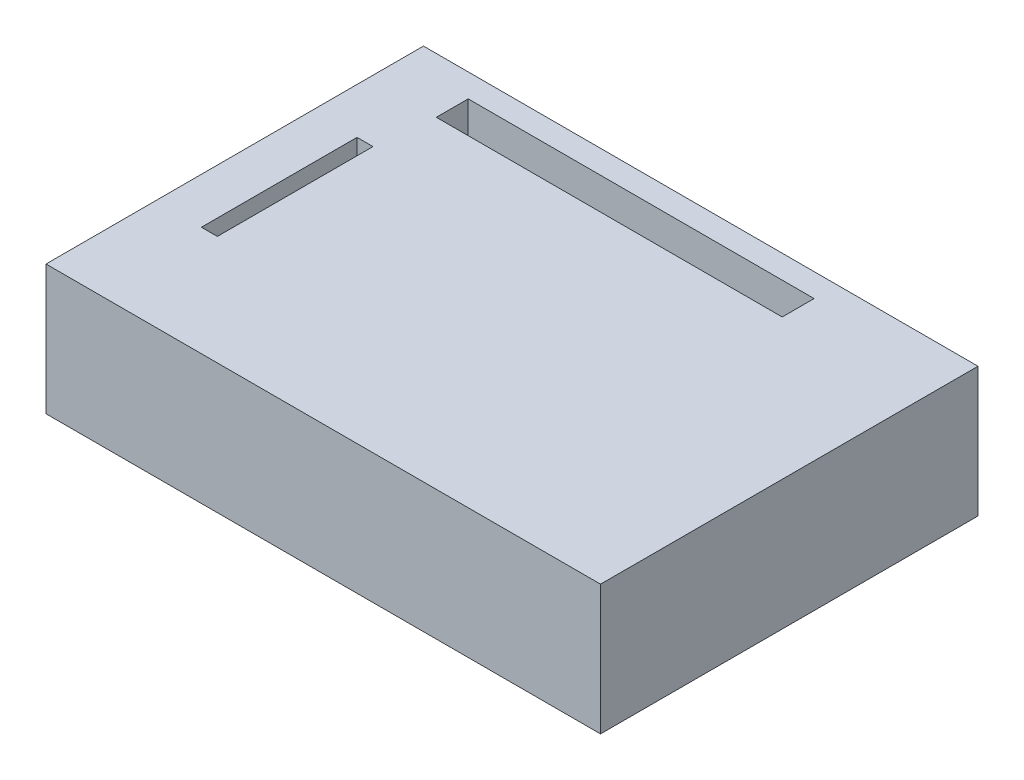
ISO-10303-21;
HEADER;
FILE_DESCRIPTION(('STEP AP214'),'2;1');
FILE_NAME('part.step','',(''),(''),'','','');
FILE_SCHEMA(('AUTOMOTIVE_DESIGN { 1 0 10303 214 1 1 1 1 }'));
ENDSEC;
DATA;
#1=APPLICATION_CONTEXT('core data for automotive mechanical design processes');
#2=APPLICATION_PROTOCOL_DEFINITION('international standard','automotive_design',2000,#1);
#3=PRODUCT_CONTEXT('',#1,'mechanical');
#4=PRODUCT('Part','Part','',(#3));
#5=PRODUCT_RELATED_PRODUCT_CATEGORY('part','',(#4));
#6=PRODUCT_DEFINITION_FORMATION('','',#4);
#7=PRODUCT_DEFINITION_CONTEXT('part definition',#1,'design');
#8=PRODUCT_DEFINITION('design','',#6,#7);
#9=PRODUCT_DEFINITION_SHAPE('','',#8);
#10=(LENGTH_UNIT() NAMED_UNIT(*) SI_UNIT(.MILLI.,.METRE.));
#11=(NAMED_UNIT(*) PLANE_ANGLE_UNIT() SI_UNIT($,.RADIAN.));
#12=(NAMED_UNIT(*) SI_UNIT($,.STERADIAN.) SOLID_ANGLE_UNIT());
#13=UNCERTAINTY_MEASURE_WITH_UNIT(LENGTH_MEASURE(1.E-05),#10,'distance_accuracy_value','');
#14=(GEOMETRIC_REPRESENTATION_CONTEXT(3) GLOBAL_UNCERTAINTY_ASSIGNED_CONTEXT((#13)) GLOBAL_UNIT_ASSIGNED_CONTEXT((#10,
#11,#12)) REPRESENTATION_CONTEXT('',''));
#15=CARTESIAN_POINT('',(0.,0.,0.));
#16=DIRECTION('',(0.,0.,1.));
#17=DIRECTION('',(1.,0.,0.));
#18=AXIS2_PLACEMENT_3D('',#15,#16,#17);
#19=CARTESIAN_POINT('',(0.,20.,0.));
#20=DIRECTION('',(0.,1.,0.));
#21=DIRECTION('',(0.,0.,1.));
#22=AXIS2_PLACEMENT_3D('',#19,#20,#21);
#23=PLANE('',#22);
#24=DIRECTION('',(0.,0.,1.));
#25=VECTOR('',#24,1.);
#26=CARTESIAN_POINT('',(0.,20.,0.));
#27=LINE('',#26,#25);
#28=CARTESIAN_POINT('',(0.,20.,0.));
#29=VERTEX_POINT('',#28);
#30=CARTESIAN_POINT('',(0.,20.,58.2));
#31=VERTEX_POINT('',#30);
#32=EDGE_CURVE('E192',#29,#31,#27,.T.);
#33=ORIENTED_EDGE('',*,*,#32,.T.);
#34=DIRECTION('',(1.,0.,0.));
#35=VECTOR('',#34,1.);
#36=CARTESIAN_POINT('',(0.,20.,58.2));
#37=LINE('',#36,#35);
#38=CARTESIAN_POINT('',(85.5,20.,58.2));
#39=VERTEX_POINT('',#38);
#40=EDGE_CURVE('E195',#31,#39,#37,.T.);
#41=ORIENTED_EDGE('',*,*,#40,.T.);
#42=DIRECTION('',(0.,0.,-1.));
#43=VECTOR('',#42,1.);
#44=CARTESIAN_POINT('',(85.5,20.,0.));
#45=LINE('',#44,#43);
#46=CARTESIAN_POINT('',(85.5,20.,0.));
#47=VERTEX_POINT('',#46);
#48=EDGE_CURVE('E198',#39,#47,#45,.T.);
#49=ORIENTED_EDGE('',*,*,#48,.T.);
#50=DIRECTION('',(-1.,0.,0.));
#51=VECTOR('',#50,1.);
#52=CARTESIAN_POINT('',(0.,20.,0.));
#53=LINE('',#52,#51);
#54=EDGE_CURVE('E200',#47,#29,#53,.T.);
#55=ORIENTED_EDGE('',*,*,#54,.T.);
#56=EDGE_LOOP('',(#33,#41,#49,#55));
#57=FACE_BOUND('',#56,.T.);
#58=DIRECTION('',(1.,0.,0.));
#59=VECTOR('',#58,1.);
#60=CARTESIAN_POINT('',(7.07,20.,41.31));
#61=LINE('',#60,#59);
#62=CARTESIAN_POINT('',(7.07,20.,41.31));
#63=VERTEX_POINT('',#62);
#64=CARTESIAN_POINT('',(9.53,20.,41.31));
#65=VERTEX_POINT('',#64);
#66=EDGE_CURVE('E163',#63,#65,#61,.T.);
#67=ORIENTED_EDGE('',*,*,#66,.F.);
#68=DIRECTION('',(0.,0.,1.));
#69=VECTOR('',#68,1.);
#70=CARTESIAN_POINT('',(7.07000000000001,20.,17.31));
#71=LINE('',#70,#69);
#72=CARTESIAN_POINT('',(7.07000000000001,20.,17.31));
#73=VERTEX_POINT('',#72);
#74=EDGE_CURVE('E161',#73,#63,#71,.T.);
#75=ORIENTED_EDGE('',*,*,#74,.F.);
#76=DIRECTION('',(-1.,0.,0.));
#77=VECTOR('',#76,1.);
#78=CARTESIAN_POINT('',(7.07000000000001,20.,17.31));
#79=LINE('',#78,#77);
#80=CARTESIAN_POINT('',(9.53000000000001,20.,17.31));
#81=VERTEX_POINT('',#80);
#82=EDGE_CURVE('E169',#81,#73,#79,.T.);
#83=ORIENTED_EDGE('',*,*,#82,.F.);
#84=DIRECTION('',(0.,0.,-1.));
#85=VECTOR('',#84,1.);
#86=CARTESIAN_POINT('',(9.53000000000001,20.,17.31));
#87=LINE('',#86,#85);
#88=EDGE_CURVE('E166',#65,#81,#87,.T.);
#89=ORIENTED_EDGE('',*,*,#88,.F.);
#90=EDGE_LOOP('',(#67,#75,#83,#89));
#91=FACE_BOUND('',#90,.T.);
#92=DIRECTION('',(1.,0.,0.));
#93=VECTOR('',#92,1.);
#94=CARTESIAN_POINT('',(10.5,20.,8.51999999999999));
#95=LINE('',#94,#93);
#96=CARTESIAN_POINT('',(10.5,20.,8.51999999999999));
#97=VERTEX_POINT('',#96);
#98=CARTESIAN_POINT('',(63.83,20.,8.52));
#99=VERTEX_POINT('',#98);
#100=EDGE_CURVE('E133',#97,#99,#95,.T.);
#101=ORIENTED_EDGE('',*,*,#100,.F.);
#102=DIRECTION('',(0.,0.,1.));
#103=VECTOR('',#102,1.);
#104=CARTESIAN_POINT('',(10.5,20.,3.59999999999999));
#105=LINE('',#104,#103);
#106=CARTESIAN_POINT('',(10.5,20.,3.59999999999999));
#107=VERTEX_POINT('',#106);
#108=EDGE_CURVE('E125',#107,#97,#105,.T.);
#109=ORIENTED_EDGE('',*,*,#108,.F.);
#110=DIRECTION('',(-1.,0.,0.));
#111=VECTOR('',#110,1.);
#112=CARTESIAN_POINT('',(10.5,20.,3.59999999999999));
#113=LINE('',#112,#111);
#114=CARTESIAN_POINT('',(63.83,20.,3.59999999999995));
#115=VERTEX_POINT('',#114);
#116=EDGE_CURVE('E147',#115,#107,#113,.T.);
#117=ORIENTED_EDGE('',*,*,#116,.F.);
#118=DIRECTION('',(0.,0.,-1.));
#119=VECTOR('',#118,1.);
#120=CARTESIAN_POINT('',(63.83,20.,3.59999999999995));
#121=LINE('',#120,#119);
#122=EDGE_CURVE('E145',#99,#115,#121,.T.);
#123=ORIENTED_EDGE('',*,*,#122,.F.);
#124=EDGE_LOOP('',(#101,#109,#117,#123));
#125=FACE_BOUND('',#124,.T.);
#126=ADVANCED_FACE('F36',(#57,#91,#125),#23,.T.);
#127=CARTESIAN_POINT('',(0.,0.,0.));
#128=DIRECTION('',(0.,1.,0.));
#129=DIRECTION('',(0.,0.,1.));
#130=AXIS2_PLACEMENT_3D('',#127,#128,#129);
#131=PLANE('',#130);
#132=DIRECTION('',(0.,0.,1.));
#133=VECTOR('',#132,1.);
#134=CARTESIAN_POINT('',(7.07000000000001,0.,17.31));
#135=LINE('',#134,#133);
#136=CARTESIAN_POINT('',(7.07000000000001,0.,17.31));
#137=VERTEX_POINT('',#136);
#138=CARTESIAN_POINT('',(7.07,0.,41.31));
#139=VERTEX_POINT('',#138);
#140=EDGE_CURVE('E141',#137,#139,#135,.T.);
#141=ORIENTED_EDGE('',*,*,#140,.T.);
#142=DIRECTION('',(1.,0.,0.));
#143=VECTOR('',#142,1.);
#144=CARTESIAN_POINT('',(7.07,0.,41.31));
#145=LINE('',#144,#143);
#146=CARTESIAN_POINT('',(9.53,0.,41.31));
#147=VERTEX_POINT('',#146);
#148=EDGE_CURVE('E174',#139,#147,#145,.T.);
#149=ORIENTED_EDGE('',*,*,#148,.T.);
#150=DIRECTION('',(0.,0.,-1.));
#151=VECTOR('',#150,1.);
#152=CARTESIAN_POINT('',(9.53000000000001,0.,17.31));
#153=LINE('',#152,#151);
#154=CARTESIAN_POINT('',(9.53000000000001,0.,17.31));
#155=VERTEX_POINT('',#154);
#156=EDGE_CURVE('E177',#147,#155,#153,.T.);
#157=ORIENTED_EDGE('',*,*,#156,.T.);
#158=DIRECTION('',(-1.,0.,0.));
#159=VECTOR('',#158,1.);
#160=CARTESIAN_POINT('',(7.07000000000001,0.,17.31));
#161=LINE('',#160,#159);
#162=EDGE_CURVE('E164',#155,#137,#161,.T.);
#163=ORIENTED_EDGE('',*,*,#162,.T.);
#164=EDGE_LOOP('',(#141,#149,#157,#163));
#165=FACE_BOUND('',#164,.T.);
#166=DIRECTION('',(0.,0.,1.));
#167=VECTOR('',#166,1.);
#168=CARTESIAN_POINT('',(0.,0.,0.));
#169=LINE('',#168,#167);
#170=CARTESIAN_POINT('',(0.,0.,0.));
#171=VERTEX_POINT('',#170);
#172=CARTESIAN_POINT('',(0.,0.,58.2));
#173=VERTEX_POINT('',#172);
#174=EDGE_CURVE('E191',#171,#173,#169,.T.);
#175=ORIENTED_EDGE('',*,*,#174,.F.);
#176=DIRECTION('',(-1.,0.,0.));
#177=VECTOR('',#176,1.);
#178=CARTESIAN_POINT('',(0.,0.,0.));
#179=LINE('',#178,#177);
#180=CARTESIAN_POINT('',(85.5,0.,0.));
#181=VERTEX_POINT('',#180);
#182=EDGE_CURVE('E196',#181,#171,#179,.T.);
#183=ORIENTED_EDGE('',*,*,#182,.F.);
#184=DIRECTION('',(0.,0.,-1.));
#185=VECTOR('',#184,1.);
#186=CARTESIAN_POINT('',(85.5,0.,0.));
#187=LINE('',#186,#185);
#188=CARTESIAN_POINT('',(85.5,0.,58.2));
#189=VERTEX_POINT('',#188);
#190=EDGE_CURVE('E207',#189,#181,#187,.T.);
#191=ORIENTED_EDGE('',*,*,#190,.F.);
#192=DIRECTION('',(1.,0.,0.));
#193=VECTOR('',#192,1.);
#194=CARTESIAN_POINT('',(0.,0.,58.2));
#195=LINE('',#194,#193);
#196=EDGE_CURVE('E205',#173,#189,#195,.T.);
#197=ORIENTED_EDGE('',*,*,#196,.F.);
#198=EDGE_LOOP('',(#175,#183,#191,#197));
#199=FACE_BOUND('',#198,.T.);
#200=DIRECTION('',(0.,0.,1.));
#201=VECTOR('',#200,1.);
#202=CARTESIAN_POINT('',(10.5,0.,3.59999999999999));
#203=LINE('',#202,#201);
#204=CARTESIAN_POINT('',(10.5,0.,3.59999999999999));
#205=VERTEX_POINT('',#204);
#206=CARTESIAN_POINT('',(10.5,0.,8.51999999999999));
#207=VERTEX_POINT('',#206);
#208=EDGE_CURVE('E59',#205,#207,#203,.T.);
#209=ORIENTED_EDGE('',*,*,#208,.T.);
#210=DIRECTION('',(1.,0.,0.));
#211=VECTOR('',#210,1.);
#212=CARTESIAN_POINT('',(10.5,0.,8.51999999999999));
#213=LINE('',#212,#211);
#214=CARTESIAN_POINT('',(63.83,0.,8.52));
#215=VERTEX_POINT('',#214);
#216=EDGE_CURVE('E140',#207,#215,#213,.T.);
#217=ORIENTED_EDGE('',*,*,#216,.T.);
#218=DIRECTION('',(0.,0.,-1.));
#219=VECTOR('',#218,1.);
#220=CARTESIAN_POINT('',(63.83,0.,3.59999999999995));
#221=LINE('',#220,#219);
#222=CARTESIAN_POINT('',(63.83,0.,3.59999999999995));
#223=VERTEX_POINT('',#222);
#224=EDGE_CURVE('E153',#215,#223,#221,.T.);
#225=ORIENTED_EDGE('',*,*,#224,.T.);
#226=DIRECTION('',(-1.,0.,0.));
#227=VECTOR('',#226,1.);
#228=CARTESIAN_POINT('',(10.5,0.,3.59999999999999));
#229=LINE('',#228,#227);
#230=EDGE_CURVE('E134',#223,#205,#229,.T.);
#231=ORIENTED_EDGE('',*,*,#230,.T.);
#232=EDGE_LOOP('',(#209,#217,#225,#231));
#233=FACE_BOUND('',#232,.T.);
#234=ADVANCED_FACE('F225',(#165,#199,#233),#131,.F.);
#235=CARTESIAN_POINT('',(0.,20.,0.));
#236=DIRECTION('',(1.,0.,0.));
#237=DIRECTION('',(0.,0.,-1.));
#238=AXIS2_PLACEMENT_3D('',#235,#236,#237);
#239=PLANE('',#238);
#240=ORIENTED_EDGE('',*,*,#174,.T.);
#241=DIRECTION('',(0.,-1.,0.));
#242=VECTOR('',#241,1.);
#243=CARTESIAN_POINT('',(0.,20.,58.2));
#244=LINE('',#243,#242);
#245=EDGE_CURVE('E11',#31,#173,#244,.T.);
#246=ORIENTED_EDGE('',*,*,#245,.F.);
#247=ORIENTED_EDGE('',*,*,#32,.F.);
#248=DIRECTION('',(0.,-1.,0.));
#249=VECTOR('',#248,1.);
#250=CARTESIAN_POINT('',(0.,20.,0.));
#251=LINE('',#250,#249);
#252=EDGE_CURVE('E202',#29,#171,#251,.T.);
#253=ORIENTED_EDGE('',*,*,#252,.T.);
#254=EDGE_LOOP('',(#240,#246,#247,#253));
#255=FACE_BOUND('',#254,.T.);
#256=ADVANCED_FACE('F38',(#255),#239,.F.);
#257=CARTESIAN_POINT('',(0.,20.,58.2));
#258=DIRECTION('',(0.,0.,-1.));
#259=DIRECTION('',(-1.,0.,0.));
#260=AXIS2_PLACEMENT_3D('',#257,#258,#259);
#261=PLANE('',#260);
#262=ORIENTED_EDGE('',*,*,#196,.T.);
#263=DIRECTION('',(0.,-1.,0.));
#264=VECTOR('',#263,1.);
#265=CARTESIAN_POINT('',(85.5,20.,58.2));
#266=LINE('',#265,#264);
#267=EDGE_CURVE('E44',#39,#189,#266,.T.);
#268=ORIENTED_EDGE('',*,*,#267,.F.);
#269=ORIENTED_EDGE('',*,*,#40,.F.);
#270=ORIENTED_EDGE('',*,*,#245,.T.);
#271=EDGE_LOOP('',(#262,#268,#269,#270));
#272=FACE_BOUND('',#271,.T.);
#273=ADVANCED_FACE('F236',(#272),#261,.F.);
#274=CARTESIAN_POINT('',(85.5,20.,0.));
#275=DIRECTION('',(-1.,0.,0.));
#276=DIRECTION('',(0.,0.,1.));
#277=AXIS2_PLACEMENT_3D('',#274,#275,#276);
#278=PLANE('',#277);
#279=ORIENTED_EDGE('',*,*,#190,.T.);
#280=DIRECTION('',(0.,-1.,0.));
#281=VECTOR('',#280,1.);
#282=CARTESIAN_POINT('',(85.5,20.,0.));
#283=LINE('',#282,#281);
#284=EDGE_CURVE('E212',#47,#181,#283,.T.);
#285=ORIENTED_EDGE('',*,*,#284,.F.);
#286=ORIENTED_EDGE('',*,*,#48,.F.);
#287=ORIENTED_EDGE('',*,*,#267,.T.);
#288=EDGE_LOOP('',(#279,#285,#286,#287));
#289=FACE_BOUND('',#288,.T.);
#290=ADVANCED_FACE('F219',(#289),#278,.F.);
#291=CARTESIAN_POINT('',(0.,20.,0.));
#292=DIRECTION('',(0.,0.,1.));
#293=DIRECTION('',(1.,0.,0.));
#294=AXIS2_PLACEMENT_3D('',#291,#292,#293);
#295=PLANE('',#294);
#296=ORIENTED_EDGE('',*,*,#182,.T.);
#297=ORIENTED_EDGE('',*,*,#252,.F.);
#298=ORIENTED_EDGE('',*,*,#54,.F.);
#299=ORIENTED_EDGE('',*,*,#284,.T.);
#300=EDGE_LOOP('',(#296,#297,#298,#299));
#301=FACE_BOUND('',#300,.T.);
#302=ADVANCED_FACE('F229',(#301),#295,.F.);
#303=CARTESIAN_POINT('',(7.07000000000001,20.,17.31));
#304=DIRECTION('',(1.,0.,0.));
#305=DIRECTION('',(0.,0.,-1.));
#306=AXIS2_PLACEMENT_3D('',#303,#304,#305);
#307=PLANE('',#306);
#308=ORIENTED_EDGE('',*,*,#140,.F.);
#309=DIRECTION('',(0.,-1.,0.));
#310=VECTOR('',#309,1.);
#311=CARTESIAN_POINT('',(7.07000000000001,20.,17.31));
#312=LINE('',#311,#310);
#313=EDGE_CURVE('E171',#73,#137,#312,.T.);
#314=ORIENTED_EDGE('',*,*,#313,.F.);
#315=ORIENTED_EDGE('',*,*,#74,.T.);
#316=DIRECTION('',(0.,-1.,0.));
#317=VECTOR('',#316,1.);
#318=CARTESIAN_POINT('',(7.07,20.,41.31));
#319=LINE('',#318,#317);
#320=EDGE_CURVE('E188',#63,#139,#319,.T.);
#321=ORIENTED_EDGE('',*,*,#320,.T.);
#322=EDGE_LOOP('',(#308,#314,#315,#321));
#323=FACE_BOUND('',#322,.T.);
#324=ADVANCED_FACE('F251',(#323),#307,.T.);
#325=CARTESIAN_POINT('',(7.07,20.,41.31));
#326=DIRECTION('',(0.,0.,-1.));
#327=DIRECTION('',(-1.,0.,0.));
#328=AXIS2_PLACEMENT_3D('',#325,#326,#327);
#329=PLANE('',#328);
#330=ORIENTED_EDGE('',*,*,#148,.F.);
#331=ORIENTED_EDGE('',*,*,#320,.F.);
#332=ORIENTED_EDGE('',*,*,#66,.T.);
#333=DIRECTION('',(0.,-1.,0.));
#334=VECTOR('',#333,1.);
#335=CARTESIAN_POINT('',(9.53,20.,41.31));
#336=LINE('',#335,#334);
#337=EDGE_CURVE('E186',#65,#147,#336,.T.);
#338=ORIENTED_EDGE('',*,*,#337,.T.);
#339=EDGE_LOOP('',(#330,#331,#332,#338));
#340=FACE_BOUND('',#339,.T.);
#341=ADVANCED_FACE('F258',(#340),#329,.T.);
#342=CARTESIAN_POINT('',(9.53000000000001,20.,17.31));
#343=DIRECTION('',(-1.,0.,0.));
#344=DIRECTION('',(0.,0.,1.));
#345=AXIS2_PLACEMENT_3D('',#342,#343,#344);
#346=PLANE('',#345);
#347=ORIENTED_EDGE('',*,*,#156,.F.);
#348=ORIENTED_EDGE('',*,*,#337,.F.);
#349=ORIENTED_EDGE('',*,*,#88,.T.);
#350=DIRECTION('',(0.,-1.,0.));
#351=VECTOR('',#350,1.);
#352=CARTESIAN_POINT('',(9.53000000000001,20.,17.31));
#353=LINE('',#352,#351);
#354=EDGE_CURVE('E184',#81,#155,#353,.T.);
#355=ORIENTED_EDGE('',*,*,#354,.T.);
#356=EDGE_LOOP('',(#347,#348,#349,#355));
#357=FACE_BOUND('',#356,.T.);
#358=ADVANCED_FACE('F263',(#357),#346,.T.);
#359=CARTESIAN_POINT('',(7.07000000000001,20.,17.31));
#360=DIRECTION('',(0.,0.,1.));
#361=DIRECTION('',(1.,0.,0.));
#362=AXIS2_PLACEMENT_3D('',#359,#360,#361);
#363=PLANE('',#362);
#364=ORIENTED_EDGE('',*,*,#162,.F.);
#365=ORIENTED_EDGE('',*,*,#354,.F.);
#366=ORIENTED_EDGE('',*,*,#82,.T.);
#367=ORIENTED_EDGE('',*,*,#313,.T.);
#368=EDGE_LOOP('',(#364,#365,#366,#367));
#369=FACE_BOUND('',#368,.T.);
#370=ADVANCED_FACE('F270',(#369),#363,.T.);
#371=CARTESIAN_POINT('',(10.5,20.,3.59999999999999));
#372=DIRECTION('',(1.,0.,0.));
#373=DIRECTION('',(0.,0.,-1.));
#374=AXIS2_PLACEMENT_3D('',#371,#372,#373);
#375=PLANE('',#374);
#376=ORIENTED_EDGE('',*,*,#208,.F.);
#377=DIRECTION('',(0.,-1.,0.));
#378=VECTOR('',#377,1.);
#379=CARTESIAN_POINT('',(10.5,20.,3.59999999999999));
#380=LINE('',#379,#378);
#381=EDGE_CURVE('E129',#107,#205,#380,.T.);
#382=ORIENTED_EDGE('',*,*,#381,.F.);
#383=ORIENTED_EDGE('',*,*,#108,.T.);
#384=DIRECTION('',(0.,-1.,0.));
#385=VECTOR('',#384,1.);
#386=CARTESIAN_POINT('',(10.5,20.,8.51999999999999));
#387=LINE('',#386,#385);
#388=EDGE_CURVE('E128',#97,#207,#387,.T.);
#389=ORIENTED_EDGE('',*,*,#388,.T.);
#390=EDGE_LOOP('',(#376,#382,#383,#389));
#391=FACE_BOUND('',#390,.T.);
#392=ADVANCED_FACE('F127',(#391),#375,.T.);
#393=CARTESIAN_POINT('',(10.5,20.,8.51999999999999));
#394=DIRECTION('',(0.,0.,-1.));
#395=DIRECTION('',(-1.,0.,0.));
#396=AXIS2_PLACEMENT_3D('',#393,#394,#395);
#397=PLANE('',#396);
#398=ORIENTED_EDGE('',*,*,#216,.F.);
#399=ORIENTED_EDGE('',*,*,#388,.F.);
#400=ORIENTED_EDGE('',*,*,#100,.T.);
#401=DIRECTION('',(0.,-1.,0.));
#402=VECTOR('',#401,1.);
#403=CARTESIAN_POINT('',(63.83,20.,8.52));
#404=LINE('',#403,#402);
#405=EDGE_CURVE('E142',#99,#215,#404,.T.);
#406=ORIENTED_EDGE('',*,*,#405,.T.);
#407=EDGE_LOOP('',(#398,#399,#400,#406));
#408=FACE_BOUND('',#407,.T.);
#409=ADVANCED_FACE('F137',(#408),#397,.T.);
#410=CARTESIAN_POINT('',(63.83,20.,3.59999999999995));
#411=DIRECTION('',(-1.,0.,0.));
#412=DIRECTION('',(0.,0.,1.));
#413=AXIS2_PLACEMENT_3D('',#410,#411,#412);
#414=PLANE('',#413);
#415=ORIENTED_EDGE('',*,*,#224,.F.);
#416=ORIENTED_EDGE('',*,*,#405,.F.);
#417=ORIENTED_EDGE('',*,*,#122,.T.);
#418=DIRECTION('',(0.,-1.,0.));
#419=VECTOR('',#418,1.);
#420=CARTESIAN_POINT('',(63.83,20.,3.59999999999995));
#421=LINE('',#420,#419);
#422=EDGE_CURVE('E51',#115,#223,#421,.T.);
#423=ORIENTED_EDGE('',*,*,#422,.T.);
#424=EDGE_LOOP('',(#415,#416,#417,#423));
#425=FACE_BOUND('',#424,.T.);
#426=ADVANCED_FACE('F288',(#425),#414,.T.);
#427=CARTESIAN_POINT('',(10.5,20.,3.59999999999999));
#428=DIRECTION('',(0.,0.,1.));
#429=DIRECTION('',(1.,0.,0.));
#430=AXIS2_PLACEMENT_3D('',#427,#428,#429);
#431=PLANE('',#430);
#432=ORIENTED_EDGE('',*,*,#230,.F.);
#433=ORIENTED_EDGE('',*,*,#422,.F.);
#434=ORIENTED_EDGE('',*,*,#116,.T.);
#435=ORIENTED_EDGE('',*,*,#381,.T.);
#436=EDGE_LOOP('',(#432,#433,#434,#435));
#437=FACE_BOUND('',#436,.T.);
#438=ADVANCED_FACE('F291',(#437),#431,.T.);
#439=CLOSED_SHELL('',(#126,#234,#256,#273,#290,#302,#324,#341,#358,#370,#392,#409,#426,#438));
#440=MANIFOLD_SOLID_BREP('B2',#439);
#441=ADVANCED_BREP_SHAPE_REPRESENTATION('',(#18,#440),#14);
#442=SHAPE_DEFINITION_REPRESENTATION(#9,#441);
ENDSEC;
END-ISO-10303-21;
